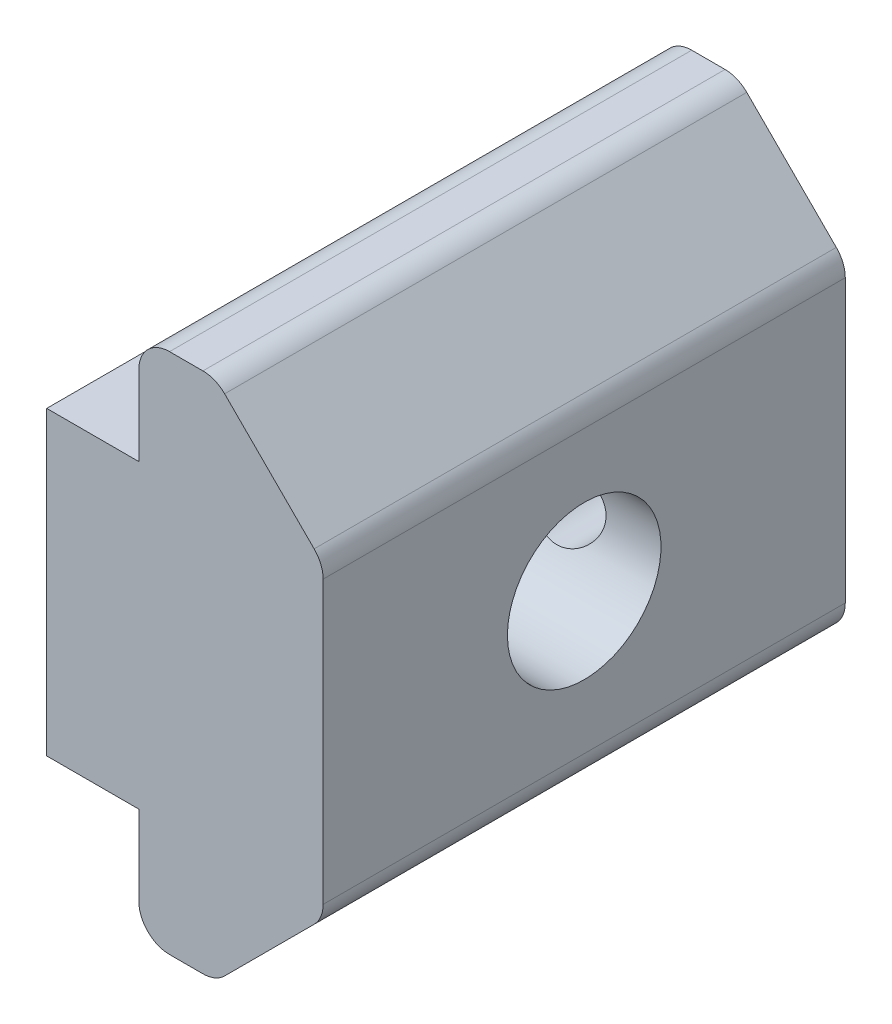
ISO-10303-21;
HEADER;
FILE_DESCRIPTION(('STEP AP214'),'2;1');
FILE_NAME('part.step','',(''),(''),'','','');
FILE_SCHEMA(('AUTOMOTIVE_DESIGN { 1 0 10303 214 1 1 1 1 }'));
ENDSEC;
DATA;
#1=APPLICATION_CONTEXT('core data for automotive mechanical design processes');
#2=APPLICATION_PROTOCOL_DEFINITION('international standard','automotive_design',2000,#1);
#3=PRODUCT_CONTEXT('',#1,'mechanical');
#4=PRODUCT('Part','Part','',(#3));
#5=PRODUCT_RELATED_PRODUCT_CATEGORY('part','',(#4));
#6=PRODUCT_DEFINITION_FORMATION('','',#4);
#7=PRODUCT_DEFINITION_CONTEXT('part definition',#1,'design');
#8=PRODUCT_DEFINITION('design','',#6,#7);
#9=PRODUCT_DEFINITION_SHAPE('','',#8);
#10=(LENGTH_UNIT() NAMED_UNIT(*) SI_UNIT(.MILLI.,.METRE.));
#11=(NAMED_UNIT(*) PLANE_ANGLE_UNIT() SI_UNIT($,.RADIAN.));
#12=(NAMED_UNIT(*) SI_UNIT($,.STERADIAN.) SOLID_ANGLE_UNIT());
#13=UNCERTAINTY_MEASURE_WITH_UNIT(LENGTH_MEASURE(1.E-05),#10,'distance_accuracy_value','');
#14=(GEOMETRIC_REPRESENTATION_CONTEXT(3) GLOBAL_UNCERTAINTY_ASSIGNED_CONTEXT((#13)) GLOBAL_UNIT_ASSIGNED_CONTEXT((#10,
#11,#12)) REPRESENTATION_CONTEXT('',''));
#15=CARTESIAN_POINT('',(0.,0.,0.));
#16=DIRECTION('',(0.,0.,1.));
#17=DIRECTION('',(1.,0.,0.));
#18=AXIS2_PLACEMENT_3D('',#15,#16,#17);
#19=CARTESIAN_POINT('',(62.500000271566,22.499999862439,-8.5));
#20=DIRECTION('',(0.,0.,1.));
#21=DIRECTION('',(1.,0.,0.));
#22=AXIS2_PLACEMENT_3D('',#19,#20,#21);
#23=CYLINDRICAL_SURFACE('',#22,0.999999999999997);
#24=DIRECTION('',(0.,0.,1.));
#25=VECTOR('',#24,1.);
#26=CARTESIAN_POINT('',(62.500000271566,21.499999862439,-8.5));
#27=LINE('',#26,#25);
#28=CARTESIAN_POINT('',(62.500000271566,21.499999862439,-8.5));
#29=VERTEX_POINT('',#28);
#30=CARTESIAN_POINT('',(62.500000271566,21.499999862439,8.5));
#31=VERTEX_POINT('',#30);
#32=EDGE_CURVE('E151',#29,#31,#27,.T.);
#33=ORIENTED_EDGE('',*,*,#32,.T.);
#34=CARTESIAN_POINT('',(62.500000271566,22.499999862439,8.5));
#35=DIRECTION('',(0.,0.,1.));
#36=DIRECTION('',(1.,0.,0.));
#37=AXIS2_PLACEMENT_3D('',#34,#35,#36);
#38=CIRCLE('',#37,0.999999999999997);
#39=CARTESIAN_POINT('',(61.500000271566,22.499999862439,8.5));
#40=VERTEX_POINT('',#39);
#41=EDGE_CURVE('E154',#40,#31,#38,.T.);
#42=ORIENTED_EDGE('',*,*,#41,.F.);
#43=DIRECTION('',(0.,0.,1.));
#44=VECTOR('',#43,1.);
#45=CARTESIAN_POINT('',(61.500000271566,22.499999862439,-8.5));
#46=LINE('',#45,#44);
#47=CARTESIAN_POINT('',(61.500000271566,22.499999862439,-8.5));
#48=VERTEX_POINT('',#47);
#49=EDGE_CURVE('E11',#48,#40,#46,.T.);
#50=ORIENTED_EDGE('',*,*,#49,.F.);
#51=CARTESIAN_POINT('',(62.500000271566,22.499999862439,-8.5));
#52=DIRECTION('',(0.,0.,1.));
#53=DIRECTION('',(1.,0.,0.));
#54=AXIS2_PLACEMENT_3D('',#51,#52,#53);
#55=CIRCLE('',#54,0.999999999999997);
#56=EDGE_CURVE('E155',#48,#29,#55,.T.);
#57=ORIENTED_EDGE('',*,*,#56,.T.);
#58=EDGE_LOOP('',(#33,#42,#50,#57));
#59=FACE_BOUND('',#58,.T.);
#60=ADVANCED_FACE('F37',(#59),#23,.T.);
#61=CARTESIAN_POINT('',(61.500000271566,22.499999862439,-8.5));
#62=DIRECTION('',(-1.,0.,0.));
#63=DIRECTION('',(0.,0.,1.));
#64=AXIS2_PLACEMENT_3D('',#61,#62,#63);
#65=PLANE('',#64);
#66=ORIENTED_EDGE('',*,*,#49,.T.);
#67=DIRECTION('',(0.,-1.,0.));
#68=VECTOR('',#67,1.);
#69=CARTESIAN_POINT('',(61.500000271566,22.499999862439,8.5));
#70=LINE('',#69,#68);
#71=CARTESIAN_POINT('',(61.500000271566,25.099999862439,8.5));
#72=VERTEX_POINT('',#71);
#73=EDGE_CURVE('E172',#72,#40,#70,.T.);
#74=ORIENTED_EDGE('',*,*,#73,.F.);
#75=DIRECTION('',(0.,0.,1.));
#76=VECTOR('',#75,1.);
#77=CARTESIAN_POINT('',(61.500000271566,25.099999862439,-8.5));
#78=LINE('',#77,#76);
#79=CARTESIAN_POINT('',(61.500000271566,25.099999862439,-8.5));
#80=VERTEX_POINT('',#79);
#81=EDGE_CURVE('E49',#80,#72,#78,.T.);
#82=ORIENTED_EDGE('',*,*,#81,.F.);
#83=DIRECTION('',(0.,-1.,0.));
#84=VECTOR('',#83,1.);
#85=CARTESIAN_POINT('',(61.500000271566,22.499999862439,-8.5));
#86=LINE('',#85,#84);
#87=EDGE_CURVE('E160',#80,#48,#86,.T.);
#88=ORIENTED_EDGE('',*,*,#87,.T.);
#89=EDGE_LOOP('',(#66,#74,#82,#88));
#90=FACE_BOUND('',#89,.T.);
#91=ADVANCED_FACE('F338',(#90),#65,.T.);
#92=CARTESIAN_POINT('',(61.500000271566,25.099999862439,-8.5));
#93=DIRECTION('',(0.,-1.,0.));
#94=DIRECTION('',(0.,0.,-1.));
#95=AXIS2_PLACEMENT_3D('',#92,#93,#94);
#96=PLANE('',#95);
#97=ORIENTED_EDGE('',*,*,#81,.T.);
#98=DIRECTION('',(1.,0.,0.));
#99=VECTOR('',#98,1.);
#100=CARTESIAN_POINT('',(61.500000271566,25.099999862439,8.5));
#101=LINE('',#100,#99);
#102=CARTESIAN_POINT('',(58.500000271566,25.099999862439,8.5));
#103=VERTEX_POINT('',#102);
#104=EDGE_CURVE('E214',#103,#72,#101,.T.);
#105=ORIENTED_EDGE('',*,*,#104,.F.);
#106=DIRECTION('',(0.,0.,1.));
#107=VECTOR('',#106,1.);
#108=CARTESIAN_POINT('',(58.500000271566,25.099999862439,-8.5));
#109=LINE('',#108,#107);
#110=CARTESIAN_POINT('',(58.500000271566,25.099999862439,-8.5));
#111=VERTEX_POINT('',#110);
#112=EDGE_CURVE('E260',#111,#103,#109,.T.);
#113=ORIENTED_EDGE('',*,*,#112,.F.);
#114=DIRECTION('',(1.,0.,0.));
#115=VECTOR('',#114,1.);
#116=CARTESIAN_POINT('',(61.500000271566,25.099999862439,-8.5));
#117=LINE('',#116,#115);
#118=EDGE_CURVE('E256',#111,#80,#117,.T.);
#119=ORIENTED_EDGE('',*,*,#118,.T.);
#120=EDGE_LOOP('',(#97,#105,#113,#119));
#121=FACE_BOUND('',#120,.T.);
#122=ADVANCED_FACE('F336',(#121),#96,.T.);
#123=CARTESIAN_POINT('',(58.500000271566,25.099999862439,-8.5));
#124=DIRECTION('',(-1.,0.,0.));
#125=DIRECTION('',(0.,0.,1.));
#126=AXIS2_PLACEMENT_3D('',#123,#124,#125);
#127=PLANE('',#126);
#128=CARTESIAN_POINT('',(58.500000271566,29.999999862439,0.));
#129=DIRECTION('',(-1.,0.,0.));
#130=DIRECTION('',(0.,0.,1.));
#131=AXIS2_PLACEMENT_3D('',#128,#129,#130);
#132=CIRCLE('',#131,2.49999999999999);
#133=CARTESIAN_POINT('',(58.500000271566,29.999999862439,2.49999999999999));
#134=VERTEX_POINT('',#133);
#135=EDGE_CURVE('E176',#134,#134,#132,.T.);
#136=ORIENTED_EDGE('',*,*,#135,.F.);
#137=EDGE_LOOP('',(#136));
#138=FACE_BOUND('',#137,.T.);
#139=ORIENTED_EDGE('',*,*,#112,.T.);
#140=DIRECTION('',(0.,-1.,0.));
#141=VECTOR('',#140,1.);
#142=CARTESIAN_POINT('',(58.500000271566,25.099999862439,8.5));
#143=LINE('',#142,#141);
#144=CARTESIAN_POINT('',(58.500000271566,34.8999998624391,8.5));
#145=VERTEX_POINT('',#144);
#146=EDGE_CURVE('E211',#145,#103,#143,.T.);
#147=ORIENTED_EDGE('',*,*,#146,.F.);
#148=DIRECTION('',(0.,0.,1.));
#149=VECTOR('',#148,1.);
#150=CARTESIAN_POINT('',(58.500000271566,34.8999998624391,-8.5));
#151=LINE('',#150,#149);
#152=CARTESIAN_POINT('',(58.500000271566,34.8999998624391,-8.5));
#153=VERTEX_POINT('',#152);
#154=EDGE_CURVE('E262',#153,#145,#151,.T.);
#155=ORIENTED_EDGE('',*,*,#154,.F.);
#156=DIRECTION('',(0.,-1.,0.));
#157=VECTOR('',#156,1.);
#158=CARTESIAN_POINT('',(58.500000271566,25.099999862439,-8.5));
#159=LINE('',#158,#157);
#160=EDGE_CURVE('E253',#153,#111,#159,.T.);
#161=ORIENTED_EDGE('',*,*,#160,.T.);
#162=EDGE_LOOP('',(#139,#147,#155,#161));
#163=FACE_BOUND('',#162,.T.);
#164=ADVANCED_FACE('F332',(#138,#163),#127,.T.);
#165=CARTESIAN_POINT('',(61.500000271566,34.8999998624391,-8.5));
#166=DIRECTION('',(0.,1.,0.));
#167=DIRECTION('',(0.,0.,1.));
#168=AXIS2_PLACEMENT_3D('',#165,#166,#167);
#169=PLANE('',#168);
#170=ORIENTED_EDGE('',*,*,#154,.T.);
#171=DIRECTION('',(-1.,0.,0.));
#172=VECTOR('',#171,1.);
#173=CARTESIAN_POINT('',(61.500000271566,34.8999998624391,8.5));
#174=LINE('',#173,#172);
#175=CARTESIAN_POINT('',(61.500000271566,34.8999998624391,8.5));
#176=VERTEX_POINT('',#175);
#177=EDGE_CURVE('E208',#176,#145,#174,.T.);
#178=ORIENTED_EDGE('',*,*,#177,.F.);
#179=DIRECTION('',(0.,0.,1.));
#180=VECTOR('',#179,1.);
#181=CARTESIAN_POINT('',(61.500000271566,34.8999998624391,-8.5));
#182=LINE('',#181,#180);
#183=CARTESIAN_POINT('',(61.500000271566,34.8999998624391,-8.5));
#184=VERTEX_POINT('',#183);
#185=EDGE_CURVE('E264',#184,#176,#182,.T.);
#186=ORIENTED_EDGE('',*,*,#185,.F.);
#187=DIRECTION('',(-1.,0.,0.));
#188=VECTOR('',#187,1.);
#189=CARTESIAN_POINT('',(61.500000271566,34.8999998624391,-8.5));
#190=LINE('',#189,#188);
#191=EDGE_CURVE('E250',#184,#153,#190,.T.);
#192=ORIENTED_EDGE('',*,*,#191,.T.);
#193=EDGE_LOOP('',(#170,#178,#186,#192));
#194=FACE_BOUND('',#193,.T.);
#195=ADVANCED_FACE('F330',(#194),#169,.T.);
#196=CARTESIAN_POINT('',(61.500000271566,34.8999998624391,-8.5));
#197=DIRECTION('',(-1.,0.,0.));
#198=DIRECTION('',(0.,0.,1.));
#199=AXIS2_PLACEMENT_3D('',#196,#197,#198);
#200=PLANE('',#199);
#201=ORIENTED_EDGE('',*,*,#185,.T.);
#202=DIRECTION('',(0.,-1.,0.));
#203=VECTOR('',#202,1.);
#204=CARTESIAN_POINT('',(61.500000271566,34.8999998624391,8.5));
#205=LINE('',#204,#203);
#206=CARTESIAN_POINT('',(61.500000271566,37.499999862439,8.5));
#207=VERTEX_POINT('',#206);
#208=EDGE_CURVE('E205',#207,#176,#205,.T.);
#209=ORIENTED_EDGE('',*,*,#208,.F.);
#210=DIRECTION('',(0.,0.,1.));
#211=VECTOR('',#210,1.);
#212=CARTESIAN_POINT('',(61.500000271566,37.499999862439,-8.5));
#213=LINE('',#212,#211);
#214=CARTESIAN_POINT('',(61.500000271566,37.499999862439,-8.5));
#215=VERTEX_POINT('',#214);
#216=EDGE_CURVE('E266',#215,#207,#213,.T.);
#217=ORIENTED_EDGE('',*,*,#216,.F.);
#218=DIRECTION('',(0.,-1.,0.));
#219=VECTOR('',#218,1.);
#220=CARTESIAN_POINT('',(61.500000271566,34.8999998624391,-8.5));
#221=LINE('',#220,#219);
#222=EDGE_CURVE('E247',#215,#184,#221,.T.);
#223=ORIENTED_EDGE('',*,*,#222,.T.);
#224=EDGE_LOOP('',(#201,#209,#217,#223));
#225=FACE_BOUND('',#224,.T.);
#226=ADVANCED_FACE('F325',(#225),#200,.T.);
#227=CARTESIAN_POINT('',(62.500000271566,37.499999862439,-8.5));
#228=DIRECTION('',(0.,0.,1.));
#229=DIRECTION('',(1.,0.,0.));
#230=AXIS2_PLACEMENT_3D('',#227,#228,#229);
#231=CYLINDRICAL_SURFACE('',#230,1.);
#232=ORIENTED_EDGE('',*,*,#216,.T.);
#233=CARTESIAN_POINT('',(62.500000271566,37.499999862439,8.5));
#234=DIRECTION('',(0.,0.,1.));
#235=DIRECTION('',(1.,0.,0.));
#236=AXIS2_PLACEMENT_3D('',#233,#234,#235);
#237=CIRCLE('',#236,1.);
#238=CARTESIAN_POINT('',(62.500000271566,38.499999862439,8.5));
#239=VERTEX_POINT('',#238);
#240=EDGE_CURVE('E202',#239,#207,#237,.T.);
#241=ORIENTED_EDGE('',*,*,#240,.F.);
#242=DIRECTION('',(0.,0.,1.));
#243=VECTOR('',#242,1.);
#244=CARTESIAN_POINT('',(62.500000271566,38.499999862439,-8.5));
#245=LINE('',#244,#243);
#246=CARTESIAN_POINT('',(62.500000271566,38.499999862439,-8.5));
#247=VERTEX_POINT('',#246);
#248=EDGE_CURVE('E268',#247,#239,#245,.T.);
#249=ORIENTED_EDGE('',*,*,#248,.F.);
#250=CARTESIAN_POINT('',(62.500000271566,37.499999862439,-8.5));
#251=DIRECTION('',(0.,0.,1.));
#252=DIRECTION('',(1.,0.,0.));
#253=AXIS2_PLACEMENT_3D('',#250,#251,#252);
#254=CIRCLE('',#253,1.);
#255=EDGE_CURVE('E244',#247,#215,#254,.T.);
#256=ORIENTED_EDGE('',*,*,#255,.T.);
#257=EDGE_LOOP('',(#232,#241,#249,#256));
#258=FACE_BOUND('',#257,.T.);
#259=ADVANCED_FACE('F320',(#258),#231,.T.);
#260=CARTESIAN_POINT('',(63.585787271566,38.499999862439,-8.5));
#261=DIRECTION('',(0.,1.,0.));
#262=DIRECTION('',(0.,0.,1.));
#263=AXIS2_PLACEMENT_3D('',#260,#261,#262);
#264=PLANE('',#263);
#265=ORIENTED_EDGE('',*,*,#248,.T.);
#266=DIRECTION('',(-1.,0.,0.));
#267=VECTOR('',#266,1.);
#268=CARTESIAN_POINT('',(63.585787271566,38.499999862439,8.5));
#269=LINE('',#268,#267);
#270=CARTESIAN_POINT('',(63.585787271566,38.499999862439,8.5));
#271=VERTEX_POINT('',#270);
#272=EDGE_CURVE('E199',#271,#239,#269,.T.);
#273=ORIENTED_EDGE('',*,*,#272,.F.);
#274=DIRECTION('',(0.,0.,1.));
#275=VECTOR('',#274,1.);
#276=CARTESIAN_POINT('',(63.585787271566,38.499999862439,-8.5));
#277=LINE('',#276,#275);
#278=CARTESIAN_POINT('',(63.585787271566,38.499999862439,-8.5));
#279=VERTEX_POINT('',#278);
#280=EDGE_CURVE('E270',#279,#271,#277,.T.);
#281=ORIENTED_EDGE('',*,*,#280,.F.);
#282=DIRECTION('',(-1.,0.,0.));
#283=VECTOR('',#282,1.);
#284=CARTESIAN_POINT('',(63.585787271566,38.499999862439,-8.5));
#285=LINE('',#284,#283);
#286=EDGE_CURVE('E241',#279,#247,#285,.T.);
#287=ORIENTED_EDGE('',*,*,#286,.T.);
#288=EDGE_LOOP('',(#265,#273,#281,#287));
#289=FACE_BOUND('',#288,.T.);
#290=ADVANCED_FACE('F318',(#289),#264,.T.);
#291=CARTESIAN_POINT('',(63.5857857091918,37.4999998624403,-8.5));
#292=DIRECTION('',(0.,0.,1.));
#293=DIRECTION('',(1.,0.,0.));
#294=AXIS2_PLACEMENT_3D('',#291,#292,#293);
#295=CYLINDRICAL_SURFACE('',#294,1.);
#296=ORIENTED_EDGE('',*,*,#280,.T.);
#297=CARTESIAN_POINT('',(63.5857857091918,37.4999998624403,8.5));
#298=DIRECTION('',(0.,0.,1.));
#299=DIRECTION('',(1.,0.,0.));
#300=AXIS2_PLACEMENT_3D('',#297,#298,#299);
#301=CIRCLE('',#300,1.);
#302=CARTESIAN_POINT('',(64.292892271566,38.207106862439,8.5));
#303=VERTEX_POINT('',#302);
#304=EDGE_CURVE('E196',#303,#271,#301,.T.);
#305=ORIENTED_EDGE('',*,*,#304,.F.);
#306=DIRECTION('',(0.,0.,1.));
#307=VECTOR('',#306,1.);
#308=CARTESIAN_POINT('',(64.292892271566,38.207106862439,-8.5));
#309=LINE('',#308,#307);
#310=CARTESIAN_POINT('',(64.292892271566,38.207106862439,-8.5));
#311=VERTEX_POINT('',#310);
#312=EDGE_CURVE('E272',#311,#303,#309,.T.);
#313=ORIENTED_EDGE('',*,*,#312,.F.);
#314=CARTESIAN_POINT('',(63.5857857091918,37.4999998624403,-8.5));
#315=DIRECTION('',(0.,0.,1.));
#316=DIRECTION('',(1.,0.,0.));
#317=AXIS2_PLACEMENT_3D('',#314,#315,#316);
#318=CIRCLE('',#317,1.);
#319=EDGE_CURVE('E238',#311,#279,#318,.T.);
#320=ORIENTED_EDGE('',*,*,#319,.T.);
#321=EDGE_LOOP('',(#296,#305,#313,#320));
#322=FACE_BOUND('',#321,.T.);
#323=ADVANCED_FACE('F313',(#322),#295,.T.);
#324=CARTESIAN_POINT('',(64.292892271566,38.207106862439,-8.5));
#325=DIRECTION('',(0.707106781186545,0.70710678118655,0.));
#326=DIRECTION('',(-0.70710678118655,0.707106781186545,0.));
#327=AXIS2_PLACEMENT_3D('',#324,#325,#326);
#328=PLANE('',#327);
#329=ORIENTED_EDGE('',*,*,#312,.T.);
#330=DIRECTION('',(-0.70710678118655,0.707106781186545,0.));
#331=VECTOR('',#330,1.);
#332=CARTESIAN_POINT('',(64.292892271566,38.207106862439,8.5));
#333=LINE('',#332,#331);
#334=CARTESIAN_POINT('',(67.2071072715661,35.292891862439,8.5));
#335=VERTEX_POINT('',#334);
#336=EDGE_CURVE('E193',#335,#303,#333,.T.);
#337=ORIENTED_EDGE('',*,*,#336,.F.);
#338=DIRECTION('',(0.,0.,1.));
#339=VECTOR('',#338,1.);
#340=CARTESIAN_POINT('',(67.2071072715661,35.292891862439,-8.5));
#341=LINE('',#340,#339);
#342=CARTESIAN_POINT('',(67.2071072715661,35.292891862439,-8.5));
#343=VERTEX_POINT('',#342);
#344=EDGE_CURVE('E274',#343,#335,#341,.T.);
#345=ORIENTED_EDGE('',*,*,#344,.F.);
#346=DIRECTION('',(-0.70710678118655,0.707106781186545,0.));
#347=VECTOR('',#346,1.);
#348=CARTESIAN_POINT('',(64.292892271566,38.207106862439,-8.5));
#349=LINE('',#348,#347);
#350=EDGE_CURVE('E235',#343,#311,#349,.T.);
#351=ORIENTED_EDGE('',*,*,#350,.T.);
#352=EDGE_LOOP('',(#329,#337,#345,#351));
#353=FACE_BOUND('',#352,.T.);
#354=ADVANCED_FACE('F308',(#353),#328,.T.);
#355=CARTESIAN_POINT('',(66.5000002715662,34.5857853000659,-8.5));
#356=DIRECTION('',(0.,0.,1.));
#357=DIRECTION('',(1.,0.,0.));
#358=AXIS2_PLACEMENT_3D('',#355,#356,#357);
#359=CYLINDRICAL_SURFACE('',#358,0.999999999999915);
#360=ORIENTED_EDGE('',*,*,#344,.T.);
#361=CARTESIAN_POINT('',(66.5000002715662,34.5857853000659,8.5));
#362=DIRECTION('',(0.,0.,1.));
#363=DIRECTION('',(1.,0.,0.));
#364=AXIS2_PLACEMENT_3D('',#361,#362,#363);
#365=CIRCLE('',#364,0.999999999999915);
#366=CARTESIAN_POINT('',(67.5000002715661,34.5857853000659,8.5));
#367=VERTEX_POINT('',#366);
#368=EDGE_CURVE('E190',#367,#335,#365,.T.);
#369=ORIENTED_EDGE('',*,*,#368,.F.);
#370=DIRECTION('',(0.,0.,1.));
#371=VECTOR('',#370,1.);
#372=CARTESIAN_POINT('',(67.5000002715661,34.5857853000659,-8.5));
#373=LINE('',#372,#371);
#374=CARTESIAN_POINT('',(67.5000002715661,34.5857853000659,-8.5));
#375=VERTEX_POINT('',#374);
#376=EDGE_CURVE('E276',#375,#367,#373,.T.);
#377=ORIENTED_EDGE('',*,*,#376,.F.);
#378=CARTESIAN_POINT('',(66.5000002715662,34.5857853000659,-8.5));
#379=DIRECTION('',(0.,0.,1.));
#380=DIRECTION('',(1.,0.,0.));
#381=AXIS2_PLACEMENT_3D('',#378,#379,#380);
#382=CIRCLE('',#381,0.999999999999915);
#383=EDGE_CURVE('E232',#375,#343,#382,.T.);
#384=ORIENTED_EDGE('',*,*,#383,.T.);
#385=EDGE_LOOP('',(#360,#369,#377,#384));
#386=FACE_BOUND('',#385,.T.);
#387=ADVANCED_FACE('F306',(#386),#359,.T.);
#388=CARTESIAN_POINT('',(67.500000271566,25.4142138624391,-8.5));
#389=DIRECTION('',(1.,0.,0.));
#390=DIRECTION('',(0.,0.,-1.));
#391=AXIS2_PLACEMENT_3D('',#388,#389,#390);
#392=PLANE('',#391);
#393=CARTESIAN_POINT('',(67.500000271567,29.999999862439,0.));
#394=DIRECTION('',(-1.,0.,0.));
#395=DIRECTION('',(0.,0.,1.));
#396=AXIS2_PLACEMENT_3D('',#393,#394,#395);
#397=CIRCLE('',#396,2.5);
#398=CARTESIAN_POINT('',(67.500000271567,29.999999862439,2.5));
#399=VERTEX_POINT('',#398);
#400=EDGE_CURVE('E173',#399,#399,#397,.T.);
#401=ORIENTED_EDGE('',*,*,#400,.T.);
#402=EDGE_LOOP('',(#401));
#403=FACE_BOUND('',#402,.T.);
#404=ORIENTED_EDGE('',*,*,#376,.T.);
#405=DIRECTION('',(0.,1.,0.));
#406=VECTOR('',#405,1.);
#407=CARTESIAN_POINT('',(67.500000271566,25.4142138624391,8.5));
#408=LINE('',#407,#406);
#409=CARTESIAN_POINT('',(67.500000271566,25.4142138624391,8.5));
#410=VERTEX_POINT('',#409);
#411=EDGE_CURVE('E187',#410,#367,#408,.T.);
#412=ORIENTED_EDGE('',*,*,#411,.F.);
#413=DIRECTION('',(0.,0.,1.));
#414=VECTOR('',#413,1.);
#415=CARTESIAN_POINT('',(67.500000271566,25.4142138624391,-8.5));
#416=LINE('',#415,#414);
#417=CARTESIAN_POINT('',(67.500000271566,25.4142138624391,-8.5));
#418=VERTEX_POINT('',#417);
#419=EDGE_CURVE('E278',#418,#410,#416,.T.);
#420=ORIENTED_EDGE('',*,*,#419,.F.);
#421=DIRECTION('',(0.,1.,0.));
#422=VECTOR('',#421,1.);
#423=CARTESIAN_POINT('',(67.500000271566,25.4142138624391,-8.5));
#424=LINE('',#423,#422);
#425=EDGE_CURVE('E229',#418,#375,#424,.T.);
#426=ORIENTED_EDGE('',*,*,#425,.T.);
#427=EDGE_LOOP('',(#404,#412,#420,#426));
#428=FACE_BOUND('',#427,.T.);
#429=ADVANCED_FACE('F301',(#403,#428),#392,.T.);
#430=CARTESIAN_POINT('',(66.500000271567,25.414212424813,-8.5));
#431=DIRECTION('',(0.,0.,1.));
#432=DIRECTION('',(1.,0.,0.));
#433=AXIS2_PLACEMENT_3D('',#430,#431,#432);
#434=CYLINDRICAL_SURFACE('',#433,0.999999999999996);
#435=ORIENTED_EDGE('',*,*,#419,.T.);
#436=CARTESIAN_POINT('',(66.500000271567,25.414212424813,8.5));
#437=DIRECTION('',(0.,0.,1.));
#438=DIRECTION('',(1.,0.,0.));
#439=AXIS2_PLACEMENT_3D('',#436,#437,#438);
#440=CIRCLE('',#439,0.999999999999996);
#441=CARTESIAN_POINT('',(67.2071072715661,24.7071058624391,8.5));
#442=VERTEX_POINT('',#441);
#443=EDGE_CURVE('E184',#442,#410,#440,.T.);
#444=ORIENTED_EDGE('',*,*,#443,.F.);
#445=DIRECTION('',(0.,0.,1.));
#446=VECTOR('',#445,1.);
#447=CARTESIAN_POINT('',(67.2071072715661,24.7071058624391,-8.5));
#448=LINE('',#447,#446);
#449=CARTESIAN_POINT('',(67.2071072715661,24.7071058624391,-8.5));
#450=VERTEX_POINT('',#449);
#451=EDGE_CURVE('E280',#450,#442,#448,.T.);
#452=ORIENTED_EDGE('',*,*,#451,.F.);
#453=CARTESIAN_POINT('',(66.500000271567,25.414212424813,-8.5));
#454=DIRECTION('',(0.,0.,1.));
#455=DIRECTION('',(1.,0.,0.));
#456=AXIS2_PLACEMENT_3D('',#453,#454,#455);
#457=CIRCLE('',#456,0.999999999999996);
#458=EDGE_CURVE('E226',#450,#418,#457,.T.);
#459=ORIENTED_EDGE('',*,*,#458,.T.);
#460=EDGE_LOOP('',(#435,#444,#452,#459));
#461=FACE_BOUND('',#460,.T.);
#462=ADVANCED_FACE('F294',(#461),#434,.T.);
#463=CARTESIAN_POINT('',(64.292892271566,21.792891862439,-8.5));
#464=DIRECTION('',(0.707106659866231,-0.707106902506843,0.));
#465=DIRECTION('',(0.707106902506843,0.707106659866231,0.));
#466=AXIS2_PLACEMENT_3D('',#463,#464,#465);
#467=PLANE('',#466);
#468=ORIENTED_EDGE('',*,*,#451,.T.);
#469=DIRECTION('',(0.707106902506843,0.707106659866231,0.));
#470=VECTOR('',#469,1.);
#471=CARTESIAN_POINT('',(64.292892271566,21.792891862439,8.5));
#472=LINE('',#471,#470);
#473=CARTESIAN_POINT('',(64.292892271566,21.792891862439,8.5));
#474=VERTEX_POINT('',#473);
#475=EDGE_CURVE('E181',#474,#442,#472,.T.);
#476=ORIENTED_EDGE('',*,*,#475,.F.);
#477=DIRECTION('',(0.,0.,1.));
#478=VECTOR('',#477,1.);
#479=CARTESIAN_POINT('',(64.292892271566,21.792891862439,-8.5));
#480=LINE('',#479,#478);
#481=CARTESIAN_POINT('',(64.292892271566,21.792891862439,-8.5));
#482=VERTEX_POINT('',#481);
#483=EDGE_CURVE('E282',#482,#474,#480,.T.);
#484=ORIENTED_EDGE('',*,*,#483,.F.);
#485=DIRECTION('',(0.707106902506843,0.707106659866231,0.));
#486=VECTOR('',#485,1.);
#487=CARTESIAN_POINT('',(64.292892271566,21.792891862439,-8.5));
#488=LINE('',#487,#486);
#489=EDGE_CURVE('E223',#482,#450,#488,.T.);
#490=ORIENTED_EDGE('',*,*,#489,.T.);
#491=EDGE_LOOP('',(#468,#476,#484,#490));
#492=FACE_BOUND('',#491,.T.);
#493=ADVANCED_FACE('F291',(#492),#467,.T.);
#494=CARTESIAN_POINT('',(63.5857867091949,22.4999998624389,-8.5));
#495=DIRECTION('',(0.,0.,1.));
#496=DIRECTION('',(1.,0.,0.));
#497=AXIS2_PLACEMENT_3D('',#494,#495,#496);
#498=CYLINDRICAL_SURFACE('',#497,0.999999999999999);
#499=ORIENTED_EDGE('',*,*,#483,.T.);
#500=CARTESIAN_POINT('',(63.5857867091949,22.4999998624389,8.5));
#501=DIRECTION('',(0.,0.,1.));
#502=DIRECTION('',(1.,0.,0.));
#503=AXIS2_PLACEMENT_3D('',#500,#501,#502);
#504=CIRCLE('',#503,0.999999999999999);
#505=CARTESIAN_POINT('',(63.585787271566,21.499999862439,8.5));
#506=VERTEX_POINT('',#505);
#507=EDGE_CURVE('E167',#506,#474,#504,.T.);
#508=ORIENTED_EDGE('',*,*,#507,.F.);
#509=DIRECTION('',(0.,0.,1.));
#510=VECTOR('',#509,1.);
#511=CARTESIAN_POINT('',(63.585787271566,21.499999862439,-8.5));
#512=LINE('',#511,#510);
#513=CARTESIAN_POINT('',(63.585787271566,21.499999862439,-8.5));
#514=VERTEX_POINT('',#513);
#515=EDGE_CURVE('E159',#514,#506,#512,.T.);
#516=ORIENTED_EDGE('',*,*,#515,.F.);
#517=CARTESIAN_POINT('',(63.5857867091949,22.4999998624389,-8.5));
#518=DIRECTION('',(0.,0.,1.));
#519=DIRECTION('',(1.,0.,0.));
#520=AXIS2_PLACEMENT_3D('',#517,#518,#519);
#521=CIRCLE('',#520,0.999999999999999);
#522=EDGE_CURVE('E220',#514,#482,#521,.T.);
#523=ORIENTED_EDGE('',*,*,#522,.T.);
#524=EDGE_LOOP('',(#499,#508,#516,#523));
#525=FACE_BOUND('',#524,.T.);
#526=ADVANCED_FACE('F285',(#525),#498,.T.);
#527=CARTESIAN_POINT('',(63.585787271566,21.499999862439,-8.5));
#528=DIRECTION('',(0.,-1.,0.));
#529=DIRECTION('',(0.,0.,-1.));
#530=AXIS2_PLACEMENT_3D('',#527,#528,#529);
#531=PLANE('',#530);
#532=ORIENTED_EDGE('',*,*,#515,.T.);
#533=DIRECTION('',(1.,0.,0.));
#534=VECTOR('',#533,1.);
#535=CARTESIAN_POINT('',(63.585787271566,21.499999862439,8.5));
#536=LINE('',#535,#534);
#537=EDGE_CURVE('E162',#31,#506,#536,.T.);
#538=ORIENTED_EDGE('',*,*,#537,.F.);
#539=ORIENTED_EDGE('',*,*,#32,.F.);
#540=DIRECTION('',(1.,0.,0.));
#541=VECTOR('',#540,1.);
#542=CARTESIAN_POINT('',(63.585787271566,21.499999862439,-8.5));
#543=LINE('',#542,#541);
#544=EDGE_CURVE('E218',#29,#514,#543,.T.);
#545=ORIENTED_EDGE('',*,*,#544,.T.);
#546=EDGE_LOOP('',(#532,#538,#539,#545));
#547=FACE_BOUND('',#546,.T.);
#548=ADVANCED_FACE('F163',(#547),#531,.T.);
#549=CARTESIAN_POINT('',(62.500000271566,22.499999862439,-8.5));
#550=DIRECTION('',(0.,0.,1.));
#551=DIRECTION('',(1.,0.,0.));
#552=AXIS2_PLACEMENT_3D('',#549,#550,#551);
#553=PLANE('',#552);
#554=CARTESIAN_POINT('',(64.461940204966,29.965764830965,-8.5));
#555=DIRECTION('',(0.,0.,-1.));
#556=DIRECTION('',(-1.,0.,0.));
#557=AXIS2_PLACEMENT_3D('',#554,#555,#556);
#558=CIRCLE('',#557,1.25);
#559=CARTESIAN_POINT('',(63.211940204966,29.965764830965,-8.5));
#560=VERTEX_POINT('',#559);
#561=EDGE_CURVE('E387',#560,#560,#558,.T.);
#562=ORIENTED_EDGE('',*,*,#561,.F.);
#563=EDGE_LOOP('',(#562));
#564=FACE_BOUND('',#563,.T.);
#565=ORIENTED_EDGE('',*,*,#56,.F.);
#566=ORIENTED_EDGE('',*,*,#87,.F.);
#567=ORIENTED_EDGE('',*,*,#118,.F.);
#568=ORIENTED_EDGE('',*,*,#160,.F.);
#569=ORIENTED_EDGE('',*,*,#191,.F.);
#570=ORIENTED_EDGE('',*,*,#222,.F.);
#571=ORIENTED_EDGE('',*,*,#255,.F.);
#572=ORIENTED_EDGE('',*,*,#286,.F.);
#573=ORIENTED_EDGE('',*,*,#319,.F.);
#574=ORIENTED_EDGE('',*,*,#350,.F.);
#575=ORIENTED_EDGE('',*,*,#383,.F.);
#576=ORIENTED_EDGE('',*,*,#425,.F.);
#577=ORIENTED_EDGE('',*,*,#458,.F.);
#578=ORIENTED_EDGE('',*,*,#489,.F.);
#579=ORIENTED_EDGE('',*,*,#522,.F.);
#580=ORIENTED_EDGE('',*,*,#544,.F.);
#581=EDGE_LOOP('',(#565,#566,#567,#568,#569,#570,#571,#572,#573,#574,#575,#576,#577,#578,#579,#580));
#582=FACE_BOUND('',#581,.T.);
#583=ADVANCED_FACE('F297',(#564,#582),#553,.F.);
#584=CARTESIAN_POINT('',(62.500000271566,22.499999862439,8.5));
#585=DIRECTION('',(0.,0.,1.));
#586=DIRECTION('',(1.,0.,0.));
#587=AXIS2_PLACEMENT_3D('',#584,#585,#586);
#588=PLANE('',#587);
#589=ORIENTED_EDGE('',*,*,#41,.T.);
#590=ORIENTED_EDGE('',*,*,#537,.T.);
#591=ORIENTED_EDGE('',*,*,#507,.T.);
#592=ORIENTED_EDGE('',*,*,#475,.T.);
#593=ORIENTED_EDGE('',*,*,#443,.T.);
#594=ORIENTED_EDGE('',*,*,#411,.T.);
#595=ORIENTED_EDGE('',*,*,#368,.T.);
#596=ORIENTED_EDGE('',*,*,#336,.T.);
#597=ORIENTED_EDGE('',*,*,#304,.T.);
#598=ORIENTED_EDGE('',*,*,#272,.T.);
#599=ORIENTED_EDGE('',*,*,#240,.T.);
#600=ORIENTED_EDGE('',*,*,#208,.T.);
#601=ORIENTED_EDGE('',*,*,#177,.T.);
#602=ORIENTED_EDGE('',*,*,#146,.T.);
#603=ORIENTED_EDGE('',*,*,#104,.T.);
#604=ORIENTED_EDGE('',*,*,#73,.T.);
#605=EDGE_LOOP('',(#589,#590,#591,#592,#593,#594,#595,#596,#597,#598,#599,#600,#601,#602,#603,#604));
#606=FACE_BOUND('',#605,.T.);
#607=ADVANCED_FACE('F170',(#606),#588,.T.);
#608=CARTESIAN_POINT('',(58.500000271566,29.999999862439,0.));
#609=DIRECTION('',(-1.,0.,0.));
#610=DIRECTION('',(0.,0.,1.));
#611=AXIS2_PLACEMENT_3D('',#608,#609,#610);
#612=CYLINDRICAL_SURFACE('',#611,2.49999999999999);
#613=CARTESIAN_POINT('',(63.211940204966,29.965764830965,-2.49976558153358));
#614=CARTESIAN_POINT('',(63.211944323233,30.0312521117521,-2.50065888771045));
#615=CARTESIAN_POINT('',(63.217116479761,30.0968512934066,-2.49895959077755));
#616=CARTESIAN_POINT('',(63.2376095604892,30.2261841114062,-2.49059429822809));
#617=CARTESIAN_POINT('',(63.2529490091888,30.2899141204417,-2.48391923414222));
#618=CARTESIAN_POINT('',(63.2930561910996,30.4134377661441,-2.46636316011536));
#619=CARTESIAN_POINT('',(63.3177889856503,30.4732450382643,-2.45549773398929));
#620=CARTESIAN_POINT('',(63.3758029754098,30.5878037400621,-2.4306229057131));
#621=CARTESIAN_POINT('',(63.409083648141,30.6425554784744,-2.41661369572917));
#622=CARTESIAN_POINT('',(63.4854224129687,30.7489923944161,-2.38584435946172));
#623=CARTESIAN_POINT('',(63.5289324650032,30.8003205480702,-2.3689724131918));
#624=CARTESIAN_POINT('',(63.62352182805,30.8953093146969,-2.33473234397568));
#625=CARTESIAN_POINT('',(63.6746065171149,30.9389644312267,-2.31736387562575));
#626=CARTESIAN_POINT('',(63.7876258416305,31.0207693111017,-2.28257674895127));
#627=CARTESIAN_POINT('',(63.8500947824234,31.0582291076727,-2.26525875678776));
#628=CARTESIAN_POINT('',(63.9813495149284,31.1219853587956,-2.23437052482272));
#629=CARTESIAN_POINT('',(64.0501313670499,31.1482887187075,-2.22079796857873));
#630=CARTESIAN_POINT('',(64.1883591478988,31.1874573302021,-2.20009445663936));
#631=CARTESIAN_POINT('',(64.2575761767065,31.2009615784795,-2.19265990993712));
#632=CARTESIAN_POINT('',(64.3976586569823,31.2160920873074,-2.18430824523282));
#633=CARTESIAN_POINT('',(64.4685224995289,31.2177294895315,-2.18338501383811));
#634=CARTESIAN_POINT('',(64.6012711903108,31.2095507057535,-2.18792054859988));
#635=CARTESIAN_POINT('',(64.6632649973673,31.2010091371437,-2.19266923045499));
#636=CARTESIAN_POINT('',(64.784793535266,31.1749503758152,-2.20674153639806));
#637=CARTESIAN_POINT('',(64.8443275264934,31.1574305044306,-2.2160665257868));
#638=CARTESIAN_POINT('',(64.9607695800082,31.1136416092879,-2.23839531133368));
#639=CARTESIAN_POINT('',(65.0175980421317,31.0871994051873,-2.25147109075628));
#640=CARTESIAN_POINT('',(65.1262786620994,31.0264414008527,-2.27981144059011));
#641=CARTESIAN_POINT('',(65.1781285898755,30.9921220952973,-2.29507698431198));
#642=CARTESIAN_POINT('',(65.2819000463057,30.9117926743603,-2.32824764933505));
#643=CARTESIAN_POINT('',(65.333091043309,30.864875976023,-2.34625031413529));
#644=CARTESIAN_POINT('',(65.4271839958854,30.7630188490898,-2.38132385711065));
#645=CARTESIAN_POINT('',(65.4700823953657,30.7080749958842,-2.3983943332963));
#646=CARTESIAN_POINT('',(65.5479969279473,30.5888625153435,-2.43047281612293));
#647=CARTESIAN_POINT('',(65.5826219458639,30.5243057055565,-2.44536883194483));
#648=CARTESIAN_POINT('',(65.640260845421,30.389358400874,-2.47044416510254));
#649=CARTESIAN_POINT('',(65.6632839141142,30.3189725733015,-2.48062721389844));
#650=CARTESIAN_POINT('',(65.6952090893155,30.1806228813017,-2.49435414751056));
#651=CARTESIAN_POINT('',(65.7051214326497,30.1129400154766,-2.49837739577097));
#652=CARTESIAN_POINT('',(65.7137494452584,29.9767748836581,-2.50081765884562));
#653=CARTESIAN_POINT('',(65.7124699653755,29.908292976843,-2.49923710267868));
#654=CARTESIAN_POINT('',(65.699335465711,29.7777721450986,-2.49089998240835));
#655=CARTESIAN_POINT('',(65.6882582307612,29.7156274770315,-2.48452916322008));
#656=CARTESIAN_POINT('',(65.6570974418744,29.5942450828179,-2.46761426128046));
#657=CARTESIAN_POINT('',(65.6370127575805,29.5350077225488,-2.45706965477445));
#658=CARTESIAN_POINT('',(65.5877759788317,29.4188587597062,-2.43226662080457));
#659=CARTESIAN_POINT('',(65.5583438316101,29.3620906008152,-2.41789606797993));
#660=CARTESIAN_POINT('',(65.4915594820724,29.2541342992592,-2.38680654912367));
#661=CARTESIAN_POINT('',(65.4542037997204,29.2029486234407,-2.37008655230319));
#662=CARTESIAN_POINT('',(65.3682728365407,29.1021207762076,-2.33387322218241));
#663=CARTESIAN_POINT('',(65.3189450332257,29.0531579668066,-2.31427041001758));
#664=CARTESIAN_POINT('',(65.2126872269274,28.963917727645,-2.27572003755489));
#665=CARTESIAN_POINT('',(65.1557517006368,28.9236466642903,-2.25677296603617));
#666=CARTESIAN_POINT('',(65.0324346920285,28.8511398300859,-2.22077433857661));
#667=CARTESIAN_POINT('',(64.9657327232904,28.8193773745997,-2.20385581118866));
#668=CARTESIAN_POINT('',(64.8267650363282,28.7679031648776,-2.17550328693814));
#669=CARTESIAN_POINT('',(64.7545073850021,28.7481742964294,-2.16406150603814));
#670=CARTESIAN_POINT('',(64.6144768165416,28.7232857533427,-2.14946247919809));
#671=CARTESIAN_POINT('',(64.5470121132402,28.716831170247,-2.14557128915767));
#672=CARTESIAN_POINT('',(64.4118850767911,28.7149437376561,-2.14444284679193));
#673=CARTESIAN_POINT('',(64.3442228455298,28.7195059599268,-2.14720261923821));
#674=CARTESIAN_POINT('',(64.2178112591383,28.7383399644854,-2.15831217582822));
#675=CARTESIAN_POINT('',(64.1588507009492,28.7515872906615,-2.16607080577661));
#676=CARTESIAN_POINT('',(64.0440613741008,28.7861577816671,-2.18563024376403));
#677=CARTESIAN_POINT('',(63.9882336374879,28.8074835900696,-2.19743237486258));
#678=CARTESIAN_POINT('',(63.8769120294108,28.8592947103928,-2.22479345568712));
#679=CARTESIAN_POINT('',(63.8217231676404,28.8903227528455,-2.24055961416862));
#680=CARTESIAN_POINT('',(63.7169688506219,28.9600406197554,-2.27375800343123));
#681=CARTESIAN_POINT('',(63.6674064169673,28.9987345307263,-2.29119112025735));
#682=CARTESIAN_POINT('',(63.5686254188595,29.0885519549104,-2.32850175356682));
#683=CARTESIAN_POINT('',(63.520284966702,29.140636633154,-2.348403083623));
#684=CARTESIAN_POINT('',(63.4328256050857,29.2526907522508,-2.38642574125894));
#685=CARTESIAN_POINT('',(63.3937122056525,29.3126648712358,-2.40454600150711));
#686=CARTESIAN_POINT('',(63.3255464864922,29.4400331913697,-2.43737915788814));
#687=CARTESIAN_POINT('',(63.2966315926717,29.5075137294436,-2.45204468836411));
#688=CARTESIAN_POINT('',(63.2509785917851,29.6472663121162,-2.47599791403697));
#689=CARTESIAN_POINT('',(63.2342055670558,29.7195239593549,-2.48530101469628));
#690=CARTESIAN_POINT('',(63.2199627069936,29.8214360594067,-2.49378185806712));
#691=CARTESIAN_POINT('',(63.216959358275,29.8501839582511,-2.49567418540094));
#692=CARTESIAN_POINT('',(63.2129471559344,29.9078688826458,-2.49846855438085));
#693=CARTESIAN_POINT('',(63.2119383838407,29.9368059158785,-2.49937055554668));
#694=CARTESIAN_POINT('',(63.211940204966,29.965764830965,-2.49976558153358));
#695=B_SPLINE_CURVE_WITH_KNOTS('',3,(#613,#614,#615,#616,#617,#618,#619,#620,#621,#622,#623,
#624,#625,#626,#627,#628,#629,#630,#631,#632,#633,#634,#635,#636,#637,#638,#639,#640,#641,#642,
#643,#644,#645,#646,#647,#648,#649,#650,#651,#652,#653,#654,#655,#656,#657,#658,#659,#660,#661,
#662,#663,#664,#665,#666,#667,#668,#669,#670,#671,#672,#673,#674,#675,#676,#677,#678,#679,#680,
#681,#682,#683,#684,#685,#686,#687,#688,#689,#690,#691,#692,#693,#694),.UNSPECIFIED.,.T.,.F.,(4,
2,2,2,2,2,2,2,2,2,2,2,2,2,2,2,2,2,2,2,2,2,2,2,2,2,2,2,2,2,2,2,2,2,2,2,2,2,2,2,4),(0.,
0.196363202432631,0.393085159760796,0.589082461942403,0.78506778690121,0.992315436360859,
1.19971094422706,1.42319816035,1.64654684480492,1.85804414062684,2.06934283781125,
2.25674057195942,2.4441942485792,2.63551840482166,2.82692786622612,3.04118990002708,
3.25554361241523,3.47860731101699,3.70149409702828,3.90595042163069,4.11031813365998,
4.29978690221989,4.48927945412532,4.68509141775141,4.88098956120882,5.09669521694117,
5.31255833747104,5.53868910093093,5.76449750590075,5.96697053400767,6.16935300504406,
6.35134717831828,6.53340095821698,6.72837785999069,6.92345898089073,7.14383870528792,
7.36434970035153,7.58772777040933,7.81046086839569,7.89729044533048,7.98412357135153),.UNSPECIFIED.);
#696=CARTESIAN_POINT('',(63.211940204966,29.965764830965,-2.49976558153358));
#697=VERTEX_POINT('',#696);
#698=EDGE_CURVE('E40',#697,#697,#695,.T.);
#699=ORIENTED_EDGE('',*,*,#698,.T.);
#700=EDGE_LOOP('',(#699));
#701=FACE_BOUND('',#700,.T.);
#702=ORIENTED_EDGE('',*,*,#400,.F.);
#703=EDGE_LOOP('',(#702));
#704=FACE_BOUND('',#703,.T.);
#705=ORIENTED_EDGE('',*,*,#135,.T.);
#706=EDGE_LOOP('',(#705));
#707=FACE_BOUND('',#706,.T.);
#708=ADVANCED_FACE('F384',(#701,#704,#707),#612,.F.);
#709=CARTESIAN_POINT('',(64.461940204966,29.965764830965,-8.5));
#710=DIRECTION('',(0.,0.,-1.));
#711=DIRECTION('',(-1.,0.,0.));
#712=AXIS2_PLACEMENT_3D('',#709,#710,#711);
#713=CYLINDRICAL_SURFACE('',#712,1.25);
#714=ORIENTED_EDGE('',*,*,#561,.T.);
#715=EDGE_LOOP('',(#714));
#716=FACE_BOUND('',#715,.T.);
#717=ORIENTED_EDGE('',*,*,#698,.F.);
#718=EDGE_LOOP('',(#717));
#719=FACE_BOUND('',#718,.T.);
#720=ADVANCED_FACE('F395',(#716,#719),#713,.F.);
#721=CLOSED_SHELL('',(#60,#91,#122,#164,#195,#226,#259,#290,#323,#354,#387,#429,#462,#493,#526,
#548,#583,#607,#708,#720));
#722=MANIFOLD_SOLID_BREP('B2',#721);
#723=ADVANCED_BREP_SHAPE_REPRESENTATION('',(#18,#722),#14);
#724=SHAPE_DEFINITION_REPRESENTATION(#9,#723);
ENDSEC;
END-ISO-10303-21;
